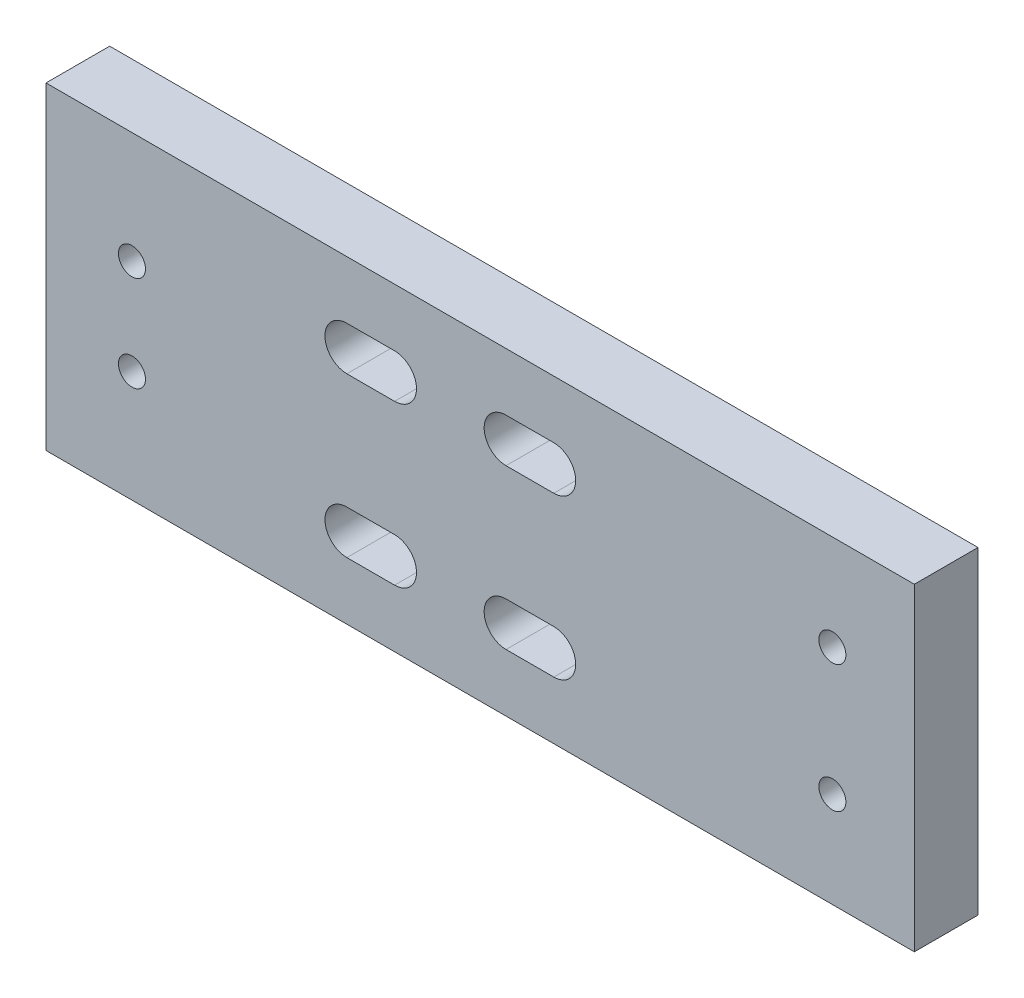
ISO-10303-21;
HEADER;
FILE_DESCRIPTION(('STEP AP214'),'2;1');
FILE_NAME('part.step','',(''),(''),'','','');
FILE_SCHEMA(('AUTOMOTIVE_DESIGN { 1 0 10303 214 1 1 1 1 }'));
ENDSEC;
DATA;
#1=APPLICATION_CONTEXT('core data for automotive mechanical design processes');
#2=APPLICATION_PROTOCOL_DEFINITION('international standard','automotive_design',2000,#1);
#3=PRODUCT_CONTEXT('',#1,'mechanical');
#4=PRODUCT('Part','Part','',(#3));
#5=PRODUCT_RELATED_PRODUCT_CATEGORY('part','',(#4));
#6=PRODUCT_DEFINITION_FORMATION('','',#4);
#7=PRODUCT_DEFINITION_CONTEXT('part definition',#1,'design');
#8=PRODUCT_DEFINITION('design','',#6,#7);
#9=PRODUCT_DEFINITION_SHAPE('','',#8);
#10=(LENGTH_UNIT() NAMED_UNIT(*) SI_UNIT(.MILLI.,.METRE.));
#11=(NAMED_UNIT(*) PLANE_ANGLE_UNIT() SI_UNIT($,.RADIAN.));
#12=(NAMED_UNIT(*) SI_UNIT($,.STERADIAN.) SOLID_ANGLE_UNIT());
#13=UNCERTAINTY_MEASURE_WITH_UNIT(LENGTH_MEASURE(1.E-05),#10,'distance_accuracy_value','');
#14=(GEOMETRIC_REPRESENTATION_CONTEXT(3) GLOBAL_UNCERTAINTY_ASSIGNED_CONTEXT((#13)) GLOBAL_UNIT_ASSIGNED_CONTEXT((#10,
#11,#12)) REPRESENTATION_CONTEXT('',''));
#15=CARTESIAN_POINT('',(0.,0.,0.));
#16=DIRECTION('',(0.,0.,1.));
#17=DIRECTION('',(1.,0.,0.));
#18=AXIS2_PLACEMENT_3D('',#15,#16,#17);
#19=CARTESIAN_POINT('',(0.,0.,246.));
#20=DIRECTION('',(0.,0.,1.));
#21=DIRECTION('',(1.,0.,0.));
#22=AXIS2_PLACEMENT_3D('',#19,#20,#21);
#23=PLANE('',#22);
#24=CARTESIAN_POINT('',(326.,292.,246.));
#25=DIRECTION('',(0.,0.,1.));
#26=DIRECTION('',(1.,0.,0.));
#27=AXIS2_PLACEMENT_3D('',#24,#25,#26);
#28=CIRCLE('',#27,1.69999999999998);
#29=CARTESIAN_POINT('',(327.7,292.,246.));
#30=VERTEX_POINT('',#29);
#31=EDGE_CURVE('E350',#30,#30,#28,.T.);
#32=ORIENTED_EDGE('',*,*,#31,.F.);
#33=EDGE_LOOP('',(#32));
#34=FACE_BOUND('',#33,.T.);
#35=CARTESIAN_POINT('',(238.,294.,246.));
#36=DIRECTION('',(0.,0.,1.));
#37=DIRECTION('',(1.,0.,0.));
#38=AXIS2_PLACEMENT_3D('',#35,#36,#37);
#39=CIRCLE('',#38,1.70000000000001);
#40=CARTESIAN_POINT('',(239.7,294.,246.));
#41=VERTEX_POINT('',#40);
#42=EDGE_CURVE('E207',#41,#41,#39,.T.);
#43=ORIENTED_EDGE('',*,*,#42,.F.);
#44=EDGE_LOOP('',(#43));
#45=FACE_BOUND('',#44,.T.);
#46=DIRECTION('',(0.,-1.,0.));
#47=VECTOR('',#46,1.);
#48=CARTESIAN_POINT('',(227.2,320.,246.));
#49=LINE('',#48,#47);
#50=CARTESIAN_POINT('',(227.2,320.,246.));
#51=VERTEX_POINT('',#50);
#52=CARTESIAN_POINT('',(227.2,280.,246.));
#53=VERTEX_POINT('',#52);
#54=EDGE_CURVE('E310',#51,#53,#49,.T.);
#55=ORIENTED_EDGE('',*,*,#54,.T.);
#56=DIRECTION('',(1.,0.,0.));
#57=VECTOR('',#56,1.);
#58=CARTESIAN_POINT('',(227.2,280.,246.));
#59=LINE('',#58,#57);
#60=CARTESIAN_POINT('',(336.3,280.,246.));
#61=VERTEX_POINT('',#60);
#62=EDGE_CURVE('E313',#53,#61,#59,.T.);
#63=ORIENTED_EDGE('',*,*,#62,.T.);
#64=DIRECTION('',(0.,1.,0.));
#65=VECTOR('',#64,1.);
#66=CARTESIAN_POINT('',(336.3,280.,246.));
#67=LINE('',#66,#65);
#68=CARTESIAN_POINT('',(336.3,320.,246.));
#69=VERTEX_POINT('',#68);
#70=EDGE_CURVE('E316',#61,#69,#67,.T.);
#71=ORIENTED_EDGE('',*,*,#70,.T.);
#72=DIRECTION('',(-1.,0.,0.));
#73=VECTOR('',#72,1.);
#74=CARTESIAN_POINT('',(336.3,320.,246.));
#75=LINE('',#74,#73);
#76=EDGE_CURVE('E318',#69,#51,#75,.T.);
#77=ORIENTED_EDGE('',*,*,#76,.T.);
#78=EDGE_LOOP('',(#55,#63,#71,#77));
#79=FACE_BOUND('',#78,.T.);
#80=DIRECTION('',(1.,0.,0.));
#81=VECTOR('',#80,1.);
#82=CARTESIAN_POINT('',(265.,287.25,246.));
#83=LINE('',#82,#81);
#84=CARTESIAN_POINT('',(265.,287.25,246.));
#85=VERTEX_POINT('',#84);
#86=CARTESIAN_POINT('',(271.,287.25,246.));
#87=VERTEX_POINT('',#86);
#88=EDGE_CURVE('E281',#85,#87,#83,.T.);
#89=ORIENTED_EDGE('',*,*,#88,.F.);
#90=CARTESIAN_POINT('',(265.,290.,246.));
#91=DIRECTION('',(0.,0.,1.));
#92=DIRECTION('',(1.,0.,0.));
#93=AXIS2_PLACEMENT_3D('',#90,#91,#92);
#94=CIRCLE('',#93,2.75);
#95=CARTESIAN_POINT('',(265.,292.75,246.));
#96=VERTEX_POINT('',#95);
#97=EDGE_CURVE('E279',#96,#85,#94,.T.);
#98=ORIENTED_EDGE('',*,*,#97,.F.);
#99=DIRECTION('',(-1.,0.,0.));
#100=VECTOR('',#99,1.);
#101=CARTESIAN_POINT('',(271.,292.75,246.));
#102=LINE('',#101,#100);
#103=CARTESIAN_POINT('',(271.,292.75,246.));
#104=VERTEX_POINT('',#103);
#105=EDGE_CURVE('E287',#104,#96,#102,.T.);
#106=ORIENTED_EDGE('',*,*,#105,.F.);
#107=CARTESIAN_POINT('',(271.,290.,246.));
#108=DIRECTION('',(0.,0.,1.));
#109=DIRECTION('',(1.,0.,0.));
#110=AXIS2_PLACEMENT_3D('',#107,#108,#109);
#111=CIRCLE('',#110,2.75);
#112=EDGE_CURVE('E284',#87,#104,#111,.T.);
#113=ORIENTED_EDGE('',*,*,#112,.F.);
#114=EDGE_LOOP('',(#89,#98,#106,#113));
#115=FACE_BOUND('',#114,.T.);
#116=DIRECTION('',(1.,0.,0.));
#117=VECTOR('',#116,1.);
#118=CARTESIAN_POINT('',(265.,307.25,246.));
#119=LINE('',#118,#117);
#120=CARTESIAN_POINT('',(265.,307.25,246.));
#121=VERTEX_POINT('',#120);
#122=CARTESIAN_POINT('',(271.,307.25,246.));
#123=VERTEX_POINT('',#122);
#124=EDGE_CURVE('E250',#121,#123,#119,.T.);
#125=ORIENTED_EDGE('',*,*,#124,.F.);
#126=CARTESIAN_POINT('',(265.,310.,246.));
#127=DIRECTION('',(0.,0.,1.));
#128=DIRECTION('',(1.,0.,0.));
#129=AXIS2_PLACEMENT_3D('',#126,#127,#128);
#130=CIRCLE('',#129,2.75);
#131=CARTESIAN_POINT('',(265.,312.75,246.));
#132=VERTEX_POINT('',#131);
#133=EDGE_CURVE('E248',#132,#121,#130,.T.);
#134=ORIENTED_EDGE('',*,*,#133,.F.);
#135=DIRECTION('',(-1.,0.,0.));
#136=VECTOR('',#135,1.);
#137=CARTESIAN_POINT('',(271.,312.75,246.));
#138=LINE('',#137,#136);
#139=CARTESIAN_POINT('',(271.,312.75,246.));
#140=VERTEX_POINT('',#139);
#141=EDGE_CURVE('E256',#140,#132,#138,.T.);
#142=ORIENTED_EDGE('',*,*,#141,.F.);
#143=CARTESIAN_POINT('',(271.,310.,246.));
#144=DIRECTION('',(0.,0.,1.));
#145=DIRECTION('',(1.,0.,0.));
#146=AXIS2_PLACEMENT_3D('',#143,#144,#145);
#147=CIRCLE('',#146,2.75);
#148=EDGE_CURVE('E253',#123,#140,#147,.T.);
#149=ORIENTED_EDGE('',*,*,#148,.F.);
#150=EDGE_LOOP('',(#125,#134,#142,#149));
#151=FACE_BOUND('',#150,.T.);
#152=DIRECTION('',(1.,0.,0.));
#153=VECTOR('',#152,1.);
#154=CARTESIAN_POINT('',(285.,287.25,246.));
#155=LINE('',#154,#153);
#156=CARTESIAN_POINT('',(285.,287.25,246.));
#157=VERTEX_POINT('',#156);
#158=CARTESIAN_POINT('',(291.,287.25,246.));
#159=VERTEX_POINT('',#158);
#160=EDGE_CURVE('E219',#157,#159,#155,.T.);
#161=ORIENTED_EDGE('',*,*,#160,.F.);
#162=CARTESIAN_POINT('',(285.,290.,246.));
#163=DIRECTION('',(0.,0.,1.));
#164=DIRECTION('',(1.,0.,0.));
#165=AXIS2_PLACEMENT_3D('',#162,#163,#164);
#166=CIRCLE('',#165,2.75);
#167=CARTESIAN_POINT('',(285.,292.75,246.));
#168=VERTEX_POINT('',#167);
#169=EDGE_CURVE('E217',#168,#157,#166,.T.);
#170=ORIENTED_EDGE('',*,*,#169,.F.);
#171=DIRECTION('',(-1.,0.,0.));
#172=VECTOR('',#171,1.);
#173=CARTESIAN_POINT('',(291.,292.75,246.));
#174=LINE('',#173,#172);
#175=CARTESIAN_POINT('',(291.,292.75,246.));
#176=VERTEX_POINT('',#175);
#177=EDGE_CURVE('E225',#176,#168,#174,.T.);
#178=ORIENTED_EDGE('',*,*,#177,.F.);
#179=CARTESIAN_POINT('',(291.,290.,246.));
#180=DIRECTION('',(0.,0.,1.));
#181=DIRECTION('',(1.,0.,0.));
#182=AXIS2_PLACEMENT_3D('',#179,#180,#181);
#183=CIRCLE('',#182,2.75);
#184=EDGE_CURVE('E222',#159,#176,#183,.T.);
#185=ORIENTED_EDGE('',*,*,#184,.F.);
#186=EDGE_LOOP('',(#161,#170,#178,#185));
#187=FACE_BOUND('',#186,.T.);
#188=DIRECTION('',(1.,0.,0.));
#189=VECTOR('',#188,1.);
#190=CARTESIAN_POINT('',(285.,307.25,246.));
#191=LINE('',#190,#189);
#192=CARTESIAN_POINT('',(285.,307.25,246.));
#193=VERTEX_POINT('',#192);
#194=CARTESIAN_POINT('',(291.,307.25,246.));
#195=VERTEX_POINT('',#194);
#196=EDGE_CURVE('E186',#193,#195,#191,.T.);
#197=ORIENTED_EDGE('',*,*,#196,.F.);
#198=CARTESIAN_POINT('',(285.,310.,246.));
#199=DIRECTION('',(0.,0.,1.));
#200=DIRECTION('',(1.,0.,0.));
#201=AXIS2_PLACEMENT_3D('',#198,#199,#200);
#202=CIRCLE('',#201,2.75);
#203=CARTESIAN_POINT('',(285.,312.75,246.));
#204=VERTEX_POINT('',#203);
#205=EDGE_CURVE('E178',#204,#193,#202,.T.);
#206=ORIENTED_EDGE('',*,*,#205,.F.);
#207=DIRECTION('',(-1.,0.,0.));
#208=VECTOR('',#207,1.);
#209=CARTESIAN_POINT('',(291.,312.75,246.));
#210=LINE('',#209,#208);
#211=CARTESIAN_POINT('',(291.,312.75,246.));
#212=VERTEX_POINT('',#211);
#213=EDGE_CURVE('E201',#212,#204,#210,.T.);
#214=ORIENTED_EDGE('',*,*,#213,.F.);
#215=CARTESIAN_POINT('',(291.,310.,246.));
#216=DIRECTION('',(0.,0.,1.));
#217=DIRECTION('',(1.,0.,0.));
#218=AXIS2_PLACEMENT_3D('',#215,#216,#217);
#219=CIRCLE('',#218,2.75);
#220=EDGE_CURVE('E199',#195,#212,#219,.T.);
#221=ORIENTED_EDGE('',*,*,#220,.F.);
#222=EDGE_LOOP('',(#197,#206,#214,#221));
#223=FACE_BOUND('',#222,.T.);
#224=CARTESIAN_POINT('',(238.,306.,246.));
#225=DIRECTION('',(0.,0.,1.));
#226=DIRECTION('',(1.,0.,0.));
#227=AXIS2_PLACEMENT_3D('',#224,#225,#226);
#228=CIRCLE('',#227,1.70000000000001);
#229=CARTESIAN_POINT('',(239.7,306.,246.));
#230=VERTEX_POINT('',#229);
#231=EDGE_CURVE('E355',#230,#230,#228,.T.);
#232=ORIENTED_EDGE('',*,*,#231,.F.);
#233=EDGE_LOOP('',(#232));
#234=FACE_BOUND('',#233,.T.);
#235=CARTESIAN_POINT('',(326.,308.,246.));
#236=DIRECTION('',(0.,0.,1.));
#237=DIRECTION('',(1.,0.,0.));
#238=AXIS2_PLACEMENT_3D('',#235,#236,#237);
#239=CIRCLE('',#238,1.69999999999998);
#240=CARTESIAN_POINT('',(327.7,308.,246.));
#241=VERTEX_POINT('',#240);
#242=EDGE_CURVE('E346',#241,#241,#239,.T.);
#243=ORIENTED_EDGE('',*,*,#242,.F.);
#244=EDGE_LOOP('',(#243));
#245=FACE_BOUND('',#244,.T.);
#246=ADVANCED_FACE('F39',(#34,#45,#79,#115,#151,#187,#223,#234,#245),#23,.T.);
#247=CARTESIAN_POINT('',(0.,0.,238.));
#248=DIRECTION('',(0.,0.,1.));
#249=DIRECTION('',(1.,0.,0.));
#250=AXIS2_PLACEMENT_3D('',#247,#248,#249);
#251=PLANE('',#250);
#252=CARTESIAN_POINT('',(238.,306.,238.));
#253=DIRECTION('',(0.,0.,1.));
#254=DIRECTION('',(1.,0.,0.));
#255=AXIS2_PLACEMENT_3D('',#252,#253,#254);
#256=CIRCLE('',#255,3.3);
#257=CARTESIAN_POINT('',(241.3,306.,238.));
#258=VERTEX_POINT('',#257);
#259=EDGE_CURVE('E625',#258,#258,#256,.T.);
#260=ORIENTED_EDGE('',*,*,#259,.T.);
#261=EDGE_LOOP('',(#260));
#262=FACE_BOUND('',#261,.T.);
#263=CARTESIAN_POINT('',(326.,292.,238.));
#264=DIRECTION('',(0.,0.,1.));
#265=DIRECTION('',(1.,0.,0.));
#266=AXIS2_PLACEMENT_3D('',#263,#264,#265);
#267=CIRCLE('',#266,3.30000000000003);
#268=CARTESIAN_POINT('',(329.3,292.,238.));
#269=VERTEX_POINT('',#268);
#270=EDGE_CURVE('E630',#269,#269,#267,.T.);
#271=ORIENTED_EDGE('',*,*,#270,.T.);
#272=EDGE_LOOP('',(#271));
#273=FACE_BOUND('',#272,.T.);
#274=CARTESIAN_POINT('',(326.,308.,238.));
#275=DIRECTION('',(0.,0.,1.));
#276=DIRECTION('',(1.,0.,0.));
#277=AXIS2_PLACEMENT_3D('',#274,#275,#276);
#278=CIRCLE('',#277,3.30000000000003);
#279=CARTESIAN_POINT('',(329.3,308.,238.));
#280=VERTEX_POINT('',#279);
#281=EDGE_CURVE('E631',#280,#280,#278,.T.);
#282=ORIENTED_EDGE('',*,*,#281,.T.);
#283=EDGE_LOOP('',(#282));
#284=FACE_BOUND('',#283,.T.);
#285=CARTESIAN_POINT('',(238.,294.,238.));
#286=DIRECTION('',(0.,0.,1.));
#287=DIRECTION('',(1.,0.,0.));
#288=AXIS2_PLACEMENT_3D('',#285,#286,#287);
#289=CIRCLE('',#288,3.3);
#290=CARTESIAN_POINT('',(241.3,294.,238.));
#291=VERTEX_POINT('',#290);
#292=EDGE_CURVE('E358',#291,#291,#289,.T.);
#293=ORIENTED_EDGE('',*,*,#292,.T.);
#294=EDGE_LOOP('',(#293));
#295=FACE_BOUND('',#294,.T.);
#296=CARTESIAN_POINT('',(285.,290.,238.));
#297=DIRECTION('',(0.,0.,1.));
#298=DIRECTION('',(1.,0.,0.));
#299=AXIS2_PLACEMENT_3D('',#296,#297,#298);
#300=CIRCLE('',#299,2.75);
#301=CARTESIAN_POINT('',(285.,292.75,238.));
#302=VERTEX_POINT('',#301);
#303=CARTESIAN_POINT('',(285.,287.25,238.));
#304=VERTEX_POINT('',#303);
#305=EDGE_CURVE('E194',#302,#304,#300,.T.);
#306=ORIENTED_EDGE('',*,*,#305,.T.);
#307=DIRECTION('',(1.,0.,0.));
#308=VECTOR('',#307,1.);
#309=CARTESIAN_POINT('',(285.,287.25,238.));
#310=LINE('',#309,#308);
#311=CARTESIAN_POINT('',(291.,287.25,238.));
#312=VERTEX_POINT('',#311);
#313=EDGE_CURVE('E230',#304,#312,#310,.T.);
#314=ORIENTED_EDGE('',*,*,#313,.T.);
#315=CARTESIAN_POINT('',(291.,290.,238.));
#316=DIRECTION('',(0.,0.,1.));
#317=DIRECTION('',(1.,0.,0.));
#318=AXIS2_PLACEMENT_3D('',#315,#316,#317);
#319=CIRCLE('',#318,2.75);
#320=CARTESIAN_POINT('',(291.,292.75,238.));
#321=VERTEX_POINT('',#320);
#322=EDGE_CURVE('E233',#312,#321,#319,.T.);
#323=ORIENTED_EDGE('',*,*,#322,.T.);
#324=DIRECTION('',(-1.,0.,0.));
#325=VECTOR('',#324,1.);
#326=CARTESIAN_POINT('',(291.,292.75,238.));
#327=LINE('',#326,#325);
#328=EDGE_CURVE('E220',#321,#302,#327,.T.);
#329=ORIENTED_EDGE('',*,*,#328,.T.);
#330=EDGE_LOOP('',(#306,#314,#323,#329));
#331=FACE_BOUND('',#330,.T.);
#332=CARTESIAN_POINT('',(265.,290.,238.));
#333=DIRECTION('',(0.,0.,1.));
#334=DIRECTION('',(1.,0.,0.));
#335=AXIS2_PLACEMENT_3D('',#332,#333,#334);
#336=CIRCLE('',#335,2.75);
#337=CARTESIAN_POINT('',(265.,292.75,238.));
#338=VERTEX_POINT('',#337);
#339=CARTESIAN_POINT('',(265.,287.25,238.));
#340=VERTEX_POINT('',#339);
#341=EDGE_CURVE('E278',#338,#340,#336,.T.);
#342=ORIENTED_EDGE('',*,*,#341,.T.);
#343=DIRECTION('',(1.,0.,0.));
#344=VECTOR('',#343,1.);
#345=CARTESIAN_POINT('',(265.,287.25,238.));
#346=LINE('',#345,#344);
#347=CARTESIAN_POINT('',(271.,287.25,238.));
#348=VERTEX_POINT('',#347);
#349=EDGE_CURVE('E292',#340,#348,#346,.T.);
#350=ORIENTED_EDGE('',*,*,#349,.T.);
#351=CARTESIAN_POINT('',(271.,290.,238.));
#352=DIRECTION('',(0.,0.,1.));
#353=DIRECTION('',(1.,0.,0.));
#354=AXIS2_PLACEMENT_3D('',#351,#352,#353);
#355=CIRCLE('',#354,2.75);
#356=CARTESIAN_POINT('',(271.,292.75,238.));
#357=VERTEX_POINT('',#356);
#358=EDGE_CURVE('E295',#348,#357,#355,.T.);
#359=ORIENTED_EDGE('',*,*,#358,.T.);
#360=DIRECTION('',(-1.,0.,0.));
#361=VECTOR('',#360,1.);
#362=CARTESIAN_POINT('',(271.,292.75,238.));
#363=LINE('',#362,#361);
#364=EDGE_CURVE('E282',#357,#338,#363,.T.);
#365=ORIENTED_EDGE('',*,*,#364,.T.);
#366=EDGE_LOOP('',(#342,#350,#359,#365));
#367=FACE_BOUND('',#366,.T.);
#368=DIRECTION('',(0.,-1.,0.));
#369=VECTOR('',#368,1.);
#370=CARTESIAN_POINT('',(227.2,320.,238.));
#371=LINE('',#370,#369);
#372=CARTESIAN_POINT('',(227.2,320.,238.));
#373=VERTEX_POINT('',#372);
#374=CARTESIAN_POINT('',(227.2,280.,238.));
#375=VERTEX_POINT('',#374);
#376=EDGE_CURVE('E309',#373,#375,#371,.T.);
#377=ORIENTED_EDGE('',*,*,#376,.F.);
#378=DIRECTION('',(-1.,0.,0.));
#379=VECTOR('',#378,1.);
#380=CARTESIAN_POINT('',(336.3,320.,238.));
#381=LINE('',#380,#379);
#382=CARTESIAN_POINT('',(336.3,320.,238.));
#383=VERTEX_POINT('',#382);
#384=EDGE_CURVE('E314',#383,#373,#381,.T.);
#385=ORIENTED_EDGE('',*,*,#384,.F.);
#386=DIRECTION('',(0.,1.,0.));
#387=VECTOR('',#386,1.);
#388=CARTESIAN_POINT('',(336.3,280.,238.));
#389=LINE('',#388,#387);
#390=CARTESIAN_POINT('',(336.3,280.,238.));
#391=VERTEX_POINT('',#390);
#392=EDGE_CURVE('E325',#391,#383,#389,.T.);
#393=ORIENTED_EDGE('',*,*,#392,.F.);
#394=DIRECTION('',(1.,0.,0.));
#395=VECTOR('',#394,1.);
#396=CARTESIAN_POINT('',(227.2,280.,238.));
#397=LINE('',#396,#395);
#398=EDGE_CURVE('E323',#375,#391,#397,.T.);
#399=ORIENTED_EDGE('',*,*,#398,.F.);
#400=EDGE_LOOP('',(#377,#385,#393,#399));
#401=FACE_BOUND('',#400,.T.);
#402=CARTESIAN_POINT('',(265.,310.,238.));
#403=DIRECTION('',(0.,0.,1.));
#404=DIRECTION('',(1.,0.,0.));
#405=AXIS2_PLACEMENT_3D('',#402,#403,#404);
#406=CIRCLE('',#405,2.75);
#407=CARTESIAN_POINT('',(265.,312.75,238.));
#408=VERTEX_POINT('',#407);
#409=CARTESIAN_POINT('',(265.,307.25,238.));
#410=VERTEX_POINT('',#409);
#411=EDGE_CURVE('E247',#408,#410,#406,.T.);
#412=ORIENTED_EDGE('',*,*,#411,.T.);
#413=DIRECTION('',(1.,0.,0.));
#414=VECTOR('',#413,1.);
#415=CARTESIAN_POINT('',(265.,307.25,238.));
#416=LINE('',#415,#414);
#417=CARTESIAN_POINT('',(271.,307.25,238.));
#418=VERTEX_POINT('',#417);
#419=EDGE_CURVE('E261',#410,#418,#416,.T.);
#420=ORIENTED_EDGE('',*,*,#419,.T.);
#421=CARTESIAN_POINT('',(271.,310.,238.));
#422=DIRECTION('',(0.,0.,1.));
#423=DIRECTION('',(1.,0.,0.));
#424=AXIS2_PLACEMENT_3D('',#421,#422,#423);
#425=CIRCLE('',#424,2.75);
#426=CARTESIAN_POINT('',(271.,312.75,238.));
#427=VERTEX_POINT('',#426);
#428=EDGE_CURVE('E264',#418,#427,#425,.T.);
#429=ORIENTED_EDGE('',*,*,#428,.T.);
#430=DIRECTION('',(-1.,0.,0.));
#431=VECTOR('',#430,1.);
#432=CARTESIAN_POINT('',(271.,312.75,238.));
#433=LINE('',#432,#431);
#434=EDGE_CURVE('E251',#427,#408,#433,.T.);
#435=ORIENTED_EDGE('',*,*,#434,.T.);
#436=EDGE_LOOP('',(#412,#420,#429,#435));
#437=FACE_BOUND('',#436,.T.);
#438=CARTESIAN_POINT('',(285.,310.,238.));
#439=DIRECTION('',(0.,0.,1.));
#440=DIRECTION('',(1.,0.,0.));
#441=AXIS2_PLACEMENT_3D('',#438,#439,#440);
#442=CIRCLE('',#441,2.75);
#443=CARTESIAN_POINT('',(285.,312.75,238.));
#444=VERTEX_POINT('',#443);
#445=CARTESIAN_POINT('',(285.,307.25,238.));
#446=VERTEX_POINT('',#445);
#447=EDGE_CURVE('E64',#444,#446,#442,.T.);
#448=ORIENTED_EDGE('',*,*,#447,.T.);
#449=DIRECTION('',(1.,0.,0.));
#450=VECTOR('',#449,1.);
#451=CARTESIAN_POINT('',(285.,307.25,238.));
#452=LINE('',#451,#450);
#453=CARTESIAN_POINT('',(291.,307.25,238.));
#454=VERTEX_POINT('',#453);
#455=EDGE_CURVE('E193',#446,#454,#452,.T.);
#456=ORIENTED_EDGE('',*,*,#455,.T.);
#457=CARTESIAN_POINT('',(291.,310.,238.));
#458=DIRECTION('',(0.,0.,1.));
#459=DIRECTION('',(1.,0.,0.));
#460=AXIS2_PLACEMENT_3D('',#457,#458,#459);
#461=CIRCLE('',#460,2.75);
#462=CARTESIAN_POINT('',(291.,312.75,238.));
#463=VERTEX_POINT('',#462);
#464=EDGE_CURVE('E209',#454,#463,#461,.T.);
#465=ORIENTED_EDGE('',*,*,#464,.T.);
#466=DIRECTION('',(-1.,0.,0.));
#467=VECTOR('',#466,1.);
#468=CARTESIAN_POINT('',(291.,312.75,238.));
#469=LINE('',#468,#467);
#470=EDGE_CURVE('E187',#463,#444,#469,.T.);
#471=ORIENTED_EDGE('',*,*,#470,.T.);
#472=EDGE_LOOP('',(#448,#456,#465,#471));
#473=FACE_BOUND('',#472,.T.);
#474=ADVANCED_FACE('F369',(#262,#273,#284,#295,#331,#367,#401,#437,#473),#251,.F.);
#475=CARTESIAN_POINT('',(227.2,320.,246.));
#476=DIRECTION('',(1.,0.,0.));
#477=DIRECTION('',(0.,0.,-1.));
#478=AXIS2_PLACEMENT_3D('',#475,#476,#477);
#479=PLANE('',#478);
#480=ORIENTED_EDGE('',*,*,#376,.T.);
#481=DIRECTION('',(0.,0.,-1.));
#482=VECTOR('',#481,1.);
#483=CARTESIAN_POINT('',(227.2,280.,246.));
#484=LINE('',#483,#482);
#485=EDGE_CURVE('E11',#53,#375,#484,.T.);
#486=ORIENTED_EDGE('',*,*,#485,.F.);
#487=ORIENTED_EDGE('',*,*,#54,.F.);
#488=DIRECTION('',(0.,0.,-1.));
#489=VECTOR('',#488,1.);
#490=CARTESIAN_POINT('',(227.2,320.,246.));
#491=LINE('',#490,#489);
#492=EDGE_CURVE('E320',#51,#373,#491,.T.);
#493=ORIENTED_EDGE('',*,*,#492,.T.);
#494=EDGE_LOOP('',(#480,#486,#487,#493));
#495=FACE_BOUND('',#494,.T.);
#496=ADVANCED_FACE('F41',(#495),#479,.F.);
#497=CARTESIAN_POINT('',(227.2,280.,246.));
#498=DIRECTION('',(0.,1.,0.));
#499=DIRECTION('',(0.,0.,1.));
#500=AXIS2_PLACEMENT_3D('',#497,#498,#499);
#501=PLANE('',#500);
#502=ORIENTED_EDGE('',*,*,#398,.T.);
#503=DIRECTION('',(0.,0.,-1.));
#504=VECTOR('',#503,1.);
#505=CARTESIAN_POINT('',(336.3,280.,246.));
#506=LINE('',#505,#504);
#507=EDGE_CURVE('E48',#61,#391,#506,.T.);
#508=ORIENTED_EDGE('',*,*,#507,.F.);
#509=ORIENTED_EDGE('',*,*,#62,.F.);
#510=ORIENTED_EDGE('',*,*,#485,.T.);
#511=EDGE_LOOP('',(#502,#508,#509,#510));
#512=FACE_BOUND('',#511,.T.);
#513=ADVANCED_FACE('F457',(#512),#501,.F.);
#514=CARTESIAN_POINT('',(336.3,280.,246.));
#515=DIRECTION('',(-1.,0.,0.));
#516=DIRECTION('',(0.,0.,1.));
#517=AXIS2_PLACEMENT_3D('',#514,#515,#516);
#518=PLANE('',#517);
#519=ORIENTED_EDGE('',*,*,#392,.T.);
#520=DIRECTION('',(0.,0.,-1.));
#521=VECTOR('',#520,1.);
#522=CARTESIAN_POINT('',(336.3,320.,246.));
#523=LINE('',#522,#521);
#524=EDGE_CURVE('E330',#69,#383,#523,.T.);
#525=ORIENTED_EDGE('',*,*,#524,.F.);
#526=ORIENTED_EDGE('',*,*,#70,.F.);
#527=ORIENTED_EDGE('',*,*,#507,.T.);
#528=EDGE_LOOP('',(#519,#525,#526,#527));
#529=FACE_BOUND('',#528,.T.);
#530=ADVANCED_FACE('F454',(#529),#518,.F.);
#531=CARTESIAN_POINT('',(336.3,320.,246.));
#532=DIRECTION('',(0.,-1.,0.));
#533=DIRECTION('',(0.,0.,-1.));
#534=AXIS2_PLACEMENT_3D('',#531,#532,#533);
#535=PLANE('',#534);
#536=ORIENTED_EDGE('',*,*,#384,.T.);
#537=ORIENTED_EDGE('',*,*,#492,.F.);
#538=ORIENTED_EDGE('',*,*,#76,.F.);
#539=ORIENTED_EDGE('',*,*,#524,.T.);
#540=EDGE_LOOP('',(#536,#537,#538,#539));
#541=FACE_BOUND('',#540,.T.);
#542=ADVANCED_FACE('F446',(#541),#535,.F.);
#543=CARTESIAN_POINT('',(265.,290.,246.));
#544=DIRECTION('',(0.,0.,-1.));
#545=DIRECTION('',(-1.,0.,0.));
#546=AXIS2_PLACEMENT_3D('',#543,#544,#545);
#547=CYLINDRICAL_SURFACE('',#546,2.75);
#548=ORIENTED_EDGE('',*,*,#341,.F.);
#549=DIRECTION('',(0.,0.,-1.));
#550=VECTOR('',#549,1.);
#551=CARTESIAN_POINT('',(265.,292.75,246.));
#552=LINE('',#551,#550);
#553=EDGE_CURVE('E289',#96,#338,#552,.T.);
#554=ORIENTED_EDGE('',*,*,#553,.F.);
#555=ORIENTED_EDGE('',*,*,#97,.T.);
#556=DIRECTION('',(0.,0.,-1.));
#557=VECTOR('',#556,1.);
#558=CARTESIAN_POINT('',(265.,287.25,246.));
#559=LINE('',#558,#557);
#560=EDGE_CURVE('E306',#85,#340,#559,.T.);
#561=ORIENTED_EDGE('',*,*,#560,.T.);
#562=EDGE_LOOP('',(#548,#554,#555,#561));
#563=FACE_BOUND('',#562,.T.);
#564=ADVANCED_FACE('F443',(#563),#547,.F.);
#565=CARTESIAN_POINT('',(265.,287.25,246.));
#566=DIRECTION('',(0.,1.,0.));
#567=DIRECTION('',(0.,0.,1.));
#568=AXIS2_PLACEMENT_3D('',#565,#566,#567);
#569=PLANE('',#568);
#570=ORIENTED_EDGE('',*,*,#349,.F.);
#571=ORIENTED_EDGE('',*,*,#560,.F.);
#572=ORIENTED_EDGE('',*,*,#88,.T.);
#573=DIRECTION('',(0.,0.,-1.));
#574=VECTOR('',#573,1.);
#575=CARTESIAN_POINT('',(271.,287.25,246.));
#576=LINE('',#575,#574);
#577=EDGE_CURVE('E304',#87,#348,#576,.T.);
#578=ORIENTED_EDGE('',*,*,#577,.T.);
#579=EDGE_LOOP('',(#570,#571,#572,#578));
#580=FACE_BOUND('',#579,.T.);
#581=ADVANCED_FACE('F439',(#580),#569,.T.);
#582=CARTESIAN_POINT('',(271.,290.,246.));
#583=DIRECTION('',(0.,0.,-1.));
#584=DIRECTION('',(-1.,0.,0.));
#585=AXIS2_PLACEMENT_3D('',#582,#583,#584);
#586=CYLINDRICAL_SURFACE('',#585,2.75);
#587=ORIENTED_EDGE('',*,*,#358,.F.);
#588=ORIENTED_EDGE('',*,*,#577,.F.);
#589=ORIENTED_EDGE('',*,*,#112,.T.);
#590=DIRECTION('',(0.,0.,-1.));
#591=VECTOR('',#590,1.);
#592=CARTESIAN_POINT('',(271.,292.75,246.));
#593=LINE('',#592,#591);
#594=EDGE_CURVE('E302',#104,#357,#593,.T.);
#595=ORIENTED_EDGE('',*,*,#594,.T.);
#596=EDGE_LOOP('',(#587,#588,#589,#595));
#597=FACE_BOUND('',#596,.T.);
#598=ADVANCED_FACE('F435',(#597),#586,.F.);
#599=CARTESIAN_POINT('',(271.,292.75,246.));
#600=DIRECTION('',(0.,-1.,0.));
#601=DIRECTION('',(0.,0.,-1.));
#602=AXIS2_PLACEMENT_3D('',#599,#600,#601);
#603=PLANE('',#602);
#604=ORIENTED_EDGE('',*,*,#364,.F.);
#605=ORIENTED_EDGE('',*,*,#594,.F.);
#606=ORIENTED_EDGE('',*,*,#105,.T.);
#607=ORIENTED_EDGE('',*,*,#553,.T.);
#608=EDGE_LOOP('',(#604,#605,#606,#607));
#609=FACE_BOUND('',#608,.T.);
#610=ADVANCED_FACE('F431',(#609),#603,.T.);
#611=CARTESIAN_POINT('',(265.,310.,246.));
#612=DIRECTION('',(0.,0.,-1.));
#613=DIRECTION('',(-1.,0.,0.));
#614=AXIS2_PLACEMENT_3D('',#611,#612,#613);
#615=CYLINDRICAL_SURFACE('',#614,2.75);
#616=ORIENTED_EDGE('',*,*,#411,.F.);
#617=DIRECTION('',(0.,0.,-1.));
#618=VECTOR('',#617,1.);
#619=CARTESIAN_POINT('',(265.,312.75,246.));
#620=LINE('',#619,#618);
#621=EDGE_CURVE('E258',#132,#408,#620,.T.);
#622=ORIENTED_EDGE('',*,*,#621,.F.);
#623=ORIENTED_EDGE('',*,*,#133,.T.);
#624=DIRECTION('',(0.,0.,-1.));
#625=VECTOR('',#624,1.);
#626=CARTESIAN_POINT('',(265.,307.25,246.));
#627=LINE('',#626,#625);
#628=EDGE_CURVE('E275',#121,#410,#627,.T.);
#629=ORIENTED_EDGE('',*,*,#628,.T.);
#630=EDGE_LOOP('',(#616,#622,#623,#629));
#631=FACE_BOUND('',#630,.T.);
#632=ADVANCED_FACE('F427',(#631),#615,.F.);
#633=CARTESIAN_POINT('',(265.,307.25,246.));
#634=DIRECTION('',(0.,1.,0.));
#635=DIRECTION('',(0.,0.,1.));
#636=AXIS2_PLACEMENT_3D('',#633,#634,#635);
#637=PLANE('',#636);
#638=ORIENTED_EDGE('',*,*,#419,.F.);
#639=ORIENTED_EDGE('',*,*,#628,.F.);
#640=ORIENTED_EDGE('',*,*,#124,.T.);
#641=DIRECTION('',(0.,0.,-1.));
#642=VECTOR('',#641,1.);
#643=CARTESIAN_POINT('',(271.,307.25,246.));
#644=LINE('',#643,#642);
#645=EDGE_CURVE('E273',#123,#418,#644,.T.);
#646=ORIENTED_EDGE('',*,*,#645,.T.);
#647=EDGE_LOOP('',(#638,#639,#640,#646));
#648=FACE_BOUND('',#647,.T.);
#649=ADVANCED_FACE('F423',(#648),#637,.T.);
#650=CARTESIAN_POINT('',(271.,310.,246.));
#651=DIRECTION('',(0.,0.,-1.));
#652=DIRECTION('',(-1.,0.,0.));
#653=AXIS2_PLACEMENT_3D('',#650,#651,#652);
#654=CYLINDRICAL_SURFACE('',#653,2.75);
#655=ORIENTED_EDGE('',*,*,#428,.F.);
#656=ORIENTED_EDGE('',*,*,#645,.F.);
#657=ORIENTED_EDGE('',*,*,#148,.T.);
#658=DIRECTION('',(0.,0.,-1.));
#659=VECTOR('',#658,1.);
#660=CARTESIAN_POINT('',(271.,312.75,246.));
#661=LINE('',#660,#659);
#662=EDGE_CURVE('E271',#140,#427,#661,.T.);
#663=ORIENTED_EDGE('',*,*,#662,.T.);
#664=EDGE_LOOP('',(#655,#656,#657,#663));
#665=FACE_BOUND('',#664,.T.);
#666=ADVANCED_FACE('F419',(#665),#654,.F.);
#667=CARTESIAN_POINT('',(271.,312.75,246.));
#668=DIRECTION('',(0.,-1.,0.));
#669=DIRECTION('',(0.,0.,-1.));
#670=AXIS2_PLACEMENT_3D('',#667,#668,#669);
#671=PLANE('',#670);
#672=ORIENTED_EDGE('',*,*,#434,.F.);
#673=ORIENTED_EDGE('',*,*,#662,.F.);
#674=ORIENTED_EDGE('',*,*,#141,.T.);
#675=ORIENTED_EDGE('',*,*,#621,.T.);
#676=EDGE_LOOP('',(#672,#673,#674,#675));
#677=FACE_BOUND('',#676,.T.);
#678=ADVANCED_FACE('F416',(#677),#671,.T.);
#679=CARTESIAN_POINT('',(285.,290.,246.));
#680=DIRECTION('',(0.,0.,-1.));
#681=DIRECTION('',(-1.,0.,0.));
#682=AXIS2_PLACEMENT_3D('',#679,#680,#681);
#683=CYLINDRICAL_SURFACE('',#682,2.75);
#684=ORIENTED_EDGE('',*,*,#305,.F.);
#685=DIRECTION('',(0.,0.,-1.));
#686=VECTOR('',#685,1.);
#687=CARTESIAN_POINT('',(285.,292.75,246.));
#688=LINE('',#687,#686);
#689=EDGE_CURVE('E227',#168,#302,#688,.T.);
#690=ORIENTED_EDGE('',*,*,#689,.F.);
#691=ORIENTED_EDGE('',*,*,#169,.T.);
#692=DIRECTION('',(0.,0.,-1.));
#693=VECTOR('',#692,1.);
#694=CARTESIAN_POINT('',(285.,287.25,246.));
#695=LINE('',#694,#693);
#696=EDGE_CURVE('E244',#157,#304,#695,.T.);
#697=ORIENTED_EDGE('',*,*,#696,.T.);
#698=EDGE_LOOP('',(#684,#690,#691,#697));
#699=FACE_BOUND('',#698,.T.);
#700=ADVANCED_FACE('F398',(#699),#683,.F.);
#701=CARTESIAN_POINT('',(285.,287.25,246.));
#702=DIRECTION('',(0.,1.,0.));
#703=DIRECTION('',(0.,0.,1.));
#704=AXIS2_PLACEMENT_3D('',#701,#702,#703);
#705=PLANE('',#704);
#706=ORIENTED_EDGE('',*,*,#313,.F.);
#707=ORIENTED_EDGE('',*,*,#696,.F.);
#708=ORIENTED_EDGE('',*,*,#160,.T.);
#709=DIRECTION('',(0.,0.,-1.));
#710=VECTOR('',#709,1.);
#711=CARTESIAN_POINT('',(291.,287.25,246.));
#712=LINE('',#711,#710);
#713=EDGE_CURVE('E242',#159,#312,#712,.T.);
#714=ORIENTED_EDGE('',*,*,#713,.T.);
#715=EDGE_LOOP('',(#706,#707,#708,#714));
#716=FACE_BOUND('',#715,.T.);
#717=ADVANCED_FACE('F390',(#716),#705,.T.);
#718=CARTESIAN_POINT('',(291.,290.,246.));
#719=DIRECTION('',(0.,0.,-1.));
#720=DIRECTION('',(-1.,0.,0.));
#721=AXIS2_PLACEMENT_3D('',#718,#719,#720);
#722=CYLINDRICAL_SURFACE('',#721,2.75);
#723=ORIENTED_EDGE('',*,*,#322,.F.);
#724=ORIENTED_EDGE('',*,*,#713,.F.);
#725=ORIENTED_EDGE('',*,*,#184,.T.);
#726=DIRECTION('',(0.,0.,-1.));
#727=VECTOR('',#726,1.);
#728=CARTESIAN_POINT('',(291.,292.75,246.));
#729=LINE('',#728,#727);
#730=EDGE_CURVE('E240',#176,#321,#729,.T.);
#731=ORIENTED_EDGE('',*,*,#730,.T.);
#732=EDGE_LOOP('',(#723,#724,#725,#731));
#733=FACE_BOUND('',#732,.T.);
#734=ADVANCED_FACE('F393',(#733),#722,.F.);
#735=CARTESIAN_POINT('',(291.,292.75,246.));
#736=DIRECTION('',(0.,-1.,0.));
#737=DIRECTION('',(0.,0.,-1.));
#738=AXIS2_PLACEMENT_3D('',#735,#736,#737);
#739=PLANE('',#738);
#740=ORIENTED_EDGE('',*,*,#328,.F.);
#741=ORIENTED_EDGE('',*,*,#730,.F.);
#742=ORIENTED_EDGE('',*,*,#177,.T.);
#743=ORIENTED_EDGE('',*,*,#689,.T.);
#744=EDGE_LOOP('',(#740,#741,#742,#743));
#745=FACE_BOUND('',#744,.T.);
#746=ADVANCED_FACE('F401',(#745),#739,.T.);
#747=CARTESIAN_POINT('',(285.,310.,246.));
#748=DIRECTION('',(0.,0.,-1.));
#749=DIRECTION('',(-1.,0.,0.));
#750=AXIS2_PLACEMENT_3D('',#747,#748,#749);
#751=CYLINDRICAL_SURFACE('',#750,2.75);
#752=ORIENTED_EDGE('',*,*,#447,.F.);
#753=DIRECTION('',(0.,0.,-1.));
#754=VECTOR('',#753,1.);
#755=CARTESIAN_POINT('',(285.,312.75,246.));
#756=LINE('',#755,#754);
#757=EDGE_CURVE('E182',#204,#444,#756,.T.);
#758=ORIENTED_EDGE('',*,*,#757,.F.);
#759=ORIENTED_EDGE('',*,*,#205,.T.);
#760=DIRECTION('',(0.,0.,-1.));
#761=VECTOR('',#760,1.);
#762=CARTESIAN_POINT('',(285.,307.25,246.));
#763=LINE('',#762,#761);
#764=EDGE_CURVE('E181',#193,#446,#763,.T.);
#765=ORIENTED_EDGE('',*,*,#764,.T.);
#766=EDGE_LOOP('',(#752,#758,#759,#765));
#767=FACE_BOUND('',#766,.T.);
#768=ADVANCED_FACE('F180',(#767),#751,.F.);
#769=CARTESIAN_POINT('',(285.,307.25,246.));
#770=DIRECTION('',(0.,1.,0.));
#771=DIRECTION('',(0.,0.,1.));
#772=AXIS2_PLACEMENT_3D('',#769,#770,#771);
#773=PLANE('',#772);
#774=ORIENTED_EDGE('',*,*,#455,.F.);
#775=ORIENTED_EDGE('',*,*,#764,.F.);
#776=ORIENTED_EDGE('',*,*,#196,.T.);
#777=DIRECTION('',(0.,0.,-1.));
#778=VECTOR('',#777,1.);
#779=CARTESIAN_POINT('',(291.,307.25,246.));
#780=LINE('',#779,#778);
#781=EDGE_CURVE('E195',#195,#454,#780,.T.);
#782=ORIENTED_EDGE('',*,*,#781,.T.);
#783=EDGE_LOOP('',(#774,#775,#776,#782));
#784=FACE_BOUND('',#783,.T.);
#785=ADVANCED_FACE('F190',(#784),#773,.T.);
#786=CARTESIAN_POINT('',(291.,310.,246.));
#787=DIRECTION('',(0.,0.,-1.));
#788=DIRECTION('',(-1.,0.,0.));
#789=AXIS2_PLACEMENT_3D('',#786,#787,#788);
#790=CYLINDRICAL_SURFACE('',#789,2.75);
#791=ORIENTED_EDGE('',*,*,#464,.F.);
#792=ORIENTED_EDGE('',*,*,#781,.F.);
#793=ORIENTED_EDGE('',*,*,#220,.T.);
#794=DIRECTION('',(0.,0.,-1.));
#795=VECTOR('',#794,1.);
#796=CARTESIAN_POINT('',(291.,312.75,246.));
#797=LINE('',#796,#795);
#798=EDGE_CURVE('E56',#212,#463,#797,.T.);
#799=ORIENTED_EDGE('',*,*,#798,.T.);
#800=EDGE_LOOP('',(#791,#792,#793,#799));
#801=FACE_BOUND('',#800,.T.);
#802=ADVANCED_FACE('F479',(#801),#790,.F.);
#803=CARTESIAN_POINT('',(291.,312.75,246.));
#804=DIRECTION('',(0.,-1.,0.));
#805=DIRECTION('',(0.,0.,-1.));
#806=AXIS2_PLACEMENT_3D('',#803,#804,#805);
#807=PLANE('',#806);
#808=ORIENTED_EDGE('',*,*,#470,.F.);
#809=ORIENTED_EDGE('',*,*,#798,.F.);
#810=ORIENTED_EDGE('',*,*,#213,.T.);
#811=ORIENTED_EDGE('',*,*,#757,.T.);
#812=EDGE_LOOP('',(#808,#809,#810,#811));
#813=FACE_BOUND('',#812,.T.);
#814=ADVANCED_FACE('F477',(#813),#807,.T.);
#815=CARTESIAN_POINT('',(238.,294.,246.));
#816=DIRECTION('',(0.,0.,-1.));
#817=DIRECTION('',(-1.,0.,0.));
#818=AXIS2_PLACEMENT_3D('',#815,#816,#817);
#819=CYLINDRICAL_SURFACE('',#818,1.70000000000001);
#820=CARTESIAN_POINT('',(238.,294.,241.5));
#821=DIRECTION('',(0.,0.,1.));
#822=DIRECTION('',(1.,0.,0.));
#823=AXIS2_PLACEMENT_3D('',#820,#821,#822);
#824=CIRCLE('',#823,1.70000000000001);
#825=CARTESIAN_POINT('',(239.7,294.,241.5));
#826=VERTEX_POINT('',#825);
#827=EDGE_CURVE('E43',#826,#826,#824,.T.);
#828=ORIENTED_EDGE('',*,*,#827,.F.);
#829=EDGE_LOOP('',(#828));
#830=FACE_BOUND('',#829,.T.);
#831=ORIENTED_EDGE('',*,*,#42,.T.);
#832=EDGE_LOOP('',(#831));
#833=FACE_BOUND('',#832,.T.);
#834=ADVANCED_FACE('F365',(#830,#833),#819,.F.);
#835=CARTESIAN_POINT('',(238.,306.,246.));
#836=DIRECTION('',(0.,0.,-1.));
#837=DIRECTION('',(-1.,0.,0.));
#838=AXIS2_PLACEMENT_3D('',#835,#836,#837);
#839=CYLINDRICAL_SURFACE('',#838,1.70000000000001);
#840=CARTESIAN_POINT('',(238.,306.,241.5));
#841=DIRECTION('',(0.,0.,1.));
#842=DIRECTION('',(1.,0.,0.));
#843=AXIS2_PLACEMENT_3D('',#840,#841,#842);
#844=CIRCLE('',#843,1.70000000000001);
#845=CARTESIAN_POINT('',(239.7,306.,241.5));
#846=VERTEX_POINT('',#845);
#847=EDGE_CURVE('E341',#846,#846,#844,.T.);
#848=ORIENTED_EDGE('',*,*,#847,.F.);
#849=EDGE_LOOP('',(#848));
#850=FACE_BOUND('',#849,.T.);
#851=ORIENTED_EDGE('',*,*,#231,.T.);
#852=EDGE_LOOP('',(#851));
#853=FACE_BOUND('',#852,.T.);
#854=ADVANCED_FACE('F485',(#850,#853),#839,.F.);
#855=CARTESIAN_POINT('',(326.,292.,246.));
#856=DIRECTION('',(0.,0.,-1.));
#857=DIRECTION('',(-1.,0.,0.));
#858=AXIS2_PLACEMENT_3D('',#855,#856,#857);
#859=CYLINDRICAL_SURFACE('',#858,1.69999999999998);
#860=CARTESIAN_POINT('',(326.,292.,241.5));
#861=DIRECTION('',(0.,0.,1.));
#862=DIRECTION('',(1.,0.,0.));
#863=AXIS2_PLACEMENT_3D('',#860,#861,#862);
#864=CIRCLE('',#863,1.69999999999998);
#865=CARTESIAN_POINT('',(327.7,292.,241.5));
#866=VERTEX_POINT('',#865);
#867=EDGE_CURVE('E338',#866,#866,#864,.T.);
#868=ORIENTED_EDGE('',*,*,#867,.F.);
#869=EDGE_LOOP('',(#868));
#870=FACE_BOUND('',#869,.T.);
#871=ORIENTED_EDGE('',*,*,#31,.T.);
#872=EDGE_LOOP('',(#871));
#873=FACE_BOUND('',#872,.T.);
#874=ADVANCED_FACE('F521',(#870,#873),#859,.F.);
#875=CARTESIAN_POINT('',(326.,308.,246.));
#876=DIRECTION('',(0.,0.,-1.));
#877=DIRECTION('',(-1.,0.,0.));
#878=AXIS2_PLACEMENT_3D('',#875,#876,#877);
#879=CYLINDRICAL_SURFACE('',#878,1.69999999999998);
#880=CARTESIAN_POINT('',(326.,308.,241.5));
#881=DIRECTION('',(0.,0.,1.));
#882=DIRECTION('',(1.,0.,0.));
#883=AXIS2_PLACEMENT_3D('',#880,#881,#882);
#884=CIRCLE('',#883,1.69999999999998);
#885=CARTESIAN_POINT('',(327.7,308.,241.5));
#886=VERTEX_POINT('',#885);
#887=EDGE_CURVE('E335',#886,#886,#884,.T.);
#888=ORIENTED_EDGE('',*,*,#887,.F.);
#889=EDGE_LOOP('',(#888));
#890=FACE_BOUND('',#889,.T.);
#891=ORIENTED_EDGE('',*,*,#242,.T.);
#892=EDGE_LOOP('',(#891));
#893=FACE_BOUND('',#892,.T.);
#894=ADVANCED_FACE('F530',(#890,#893),#879,.F.);
#895=CARTESIAN_POINT('',(326.,308.,241.5));
#896=DIRECTION('',(0.,0.,-1.));
#897=DIRECTION('',(-1.,0.,0.));
#898=AXIS2_PLACEMENT_3D('',#895,#896,#897);
#899=CYLINDRICAL_SURFACE('',#898,3.30000000000003);
#900=CARTESIAN_POINT('',(326.,308.,241.5));
#901=DIRECTION('',(0.,0.,1.));
#902=DIRECTION('',(1.,0.,0.));
#903=AXIS2_PLACEMENT_3D('',#900,#901,#902);
#904=CIRCLE('',#903,3.30000000000003);
#905=CARTESIAN_POINT('',(329.3,308.,241.5));
#906=VERTEX_POINT('',#905);
#907=EDGE_CURVE('E639',#906,#906,#904,.T.);
#908=ORIENTED_EDGE('',*,*,#907,.T.);
#909=EDGE_LOOP('',(#908));
#910=FACE_BOUND('',#909,.T.);
#911=ORIENTED_EDGE('',*,*,#281,.F.);
#912=EDGE_LOOP('',(#911));
#913=FACE_BOUND('',#912,.T.);
#914=ADVANCED_FACE('F540',(#910,#913),#899,.F.);
#915=CARTESIAN_POINT('',(326.,308.,241.5));
#916=DIRECTION('',(0.,0.,1.));
#917=DIRECTION('',(1.,0.,0.));
#918=AXIS2_PLACEMENT_3D('',#915,#916,#917);
#919=PLANE('',#918);
#920=ORIENTED_EDGE('',*,*,#887,.T.);
#921=EDGE_LOOP('',(#920));
#922=FACE_BOUND('',#921,.T.);
#923=ORIENTED_EDGE('',*,*,#907,.F.);
#924=EDGE_LOOP('',(#923));
#925=FACE_BOUND('',#924,.T.);
#926=ADVANCED_FACE('F550',(#922,#925),#919,.F.);
#927=CARTESIAN_POINT('',(326.,292.,241.5));
#928=DIRECTION('',(0.,0.,-1.));
#929=DIRECTION('',(-1.,0.,0.));
#930=AXIS2_PLACEMENT_3D('',#927,#928,#929);
#931=CYLINDRICAL_SURFACE('',#930,3.30000000000003);
#932=CARTESIAN_POINT('',(326.,292.,241.5));
#933=DIRECTION('',(0.,0.,1.));
#934=DIRECTION('',(1.,0.,0.));
#935=AXIS2_PLACEMENT_3D('',#932,#933,#934);
#936=CIRCLE('',#935,3.30000000000003);
#937=CARTESIAN_POINT('',(329.3,292.,241.5));
#938=VERTEX_POINT('',#937);
#939=EDGE_CURVE('E627',#938,#938,#936,.T.);
#940=ORIENTED_EDGE('',*,*,#939,.T.);
#941=EDGE_LOOP('',(#940));
#942=FACE_BOUND('',#941,.T.);
#943=ORIENTED_EDGE('',*,*,#270,.F.);
#944=EDGE_LOOP('',(#943));
#945=FACE_BOUND('',#944,.T.);
#946=ADVANCED_FACE('F560',(#942,#945),#931,.F.);
#947=CARTESIAN_POINT('',(326.,292.,241.5));
#948=DIRECTION('',(0.,0.,1.));
#949=DIRECTION('',(1.,0.,0.));
#950=AXIS2_PLACEMENT_3D('',#947,#948,#949);
#951=PLANE('',#950);
#952=ORIENTED_EDGE('',*,*,#867,.T.);
#953=EDGE_LOOP('',(#952));
#954=FACE_BOUND('',#953,.T.);
#955=ORIENTED_EDGE('',*,*,#939,.F.);
#956=EDGE_LOOP('',(#955));
#957=FACE_BOUND('',#956,.T.);
#958=ADVANCED_FACE('F570',(#954,#957),#951,.F.);
#959=CARTESIAN_POINT('',(238.,306.,241.5));
#960=DIRECTION('',(0.,0.,-1.));
#961=DIRECTION('',(-1.,0.,0.));
#962=AXIS2_PLACEMENT_3D('',#959,#960,#961);
#963=CYLINDRICAL_SURFACE('',#962,3.3);
#964=CARTESIAN_POINT('',(238.,306.,241.5));
#965=DIRECTION('',(0.,0.,1.));
#966=DIRECTION('',(1.,0.,0.));
#967=AXIS2_PLACEMENT_3D('',#964,#965,#966);
#968=CIRCLE('',#967,3.3);
#969=CARTESIAN_POINT('',(241.3,306.,241.5));
#970=VERTEX_POINT('',#969);
#971=EDGE_CURVE('E634',#970,#970,#968,.T.);
#972=ORIENTED_EDGE('',*,*,#971,.T.);
#973=EDGE_LOOP('',(#972));
#974=FACE_BOUND('',#973,.T.);
#975=ORIENTED_EDGE('',*,*,#259,.F.);
#976=EDGE_LOOP('',(#975));
#977=FACE_BOUND('',#976,.T.);
#978=ADVANCED_FACE('F580',(#974,#977),#963,.F.);
#979=CARTESIAN_POINT('',(238.,306.,241.5));
#980=DIRECTION('',(0.,0.,1.));
#981=DIRECTION('',(1.,0.,0.));
#982=AXIS2_PLACEMENT_3D('',#979,#980,#981);
#983=PLANE('',#982);
#984=ORIENTED_EDGE('',*,*,#847,.T.);
#985=EDGE_LOOP('',(#984));
#986=FACE_BOUND('',#985,.T.);
#987=ORIENTED_EDGE('',*,*,#971,.F.);
#988=EDGE_LOOP('',(#987));
#989=FACE_BOUND('',#988,.T.);
#990=ADVANCED_FACE('F590',(#986,#989),#983,.F.);
#991=CARTESIAN_POINT('',(238.,294.,241.5));
#992=DIRECTION('',(0.,0.,-1.));
#993=DIRECTION('',(-1.,0.,0.));
#994=AXIS2_PLACEMENT_3D('',#991,#992,#993);
#995=CYLINDRICAL_SURFACE('',#994,3.3);
#996=CARTESIAN_POINT('',(238.,294.,241.5));
#997=DIRECTION('',(0.,0.,1.));
#998=DIRECTION('',(1.,0.,0.));
#999=AXIS2_PLACEMENT_3D('',#996,#997,#998);
#1000=CIRCLE('',#999,3.3);
#1001=CARTESIAN_POINT('',(241.3,294.,241.5));
#1002=VERTEX_POINT('',#1001);
#1003=EDGE_CURVE('E339',#1002,#1002,#1000,.T.);
#1004=ORIENTED_EDGE('',*,*,#1003,.T.);
#1005=EDGE_LOOP('',(#1004));
#1006=FACE_BOUND('',#1005,.T.);
#1007=ORIENTED_EDGE('',*,*,#292,.F.);
#1008=EDGE_LOOP('',(#1007));
#1009=FACE_BOUND('',#1008,.T.);
#1010=ADVANCED_FACE('F600',(#1006,#1009),#995,.F.);
#1011=CARTESIAN_POINT('',(238.,294.,241.5));
#1012=DIRECTION('',(0.,0.,1.));
#1013=DIRECTION('',(1.,0.,0.));
#1014=AXIS2_PLACEMENT_3D('',#1011,#1012,#1013);
#1015=PLANE('',#1014);
#1016=ORIENTED_EDGE('',*,*,#827,.T.);
#1017=EDGE_LOOP('',(#1016));
#1018=FACE_BOUND('',#1017,.T.);
#1019=ORIENTED_EDGE('',*,*,#1003,.F.);
#1020=EDGE_LOOP('',(#1019));
#1021=FACE_BOUND('',#1020,.T.);
#1022=ADVANCED_FACE('F609',(#1018,#1021),#1015,.F.);
#1023=CLOSED_SHELL('',(#246,#474,#496,#513,#530,#542,#564,#581,#598,#610,#632,#649,#666,#678,
#700,#717,#734,#746,#768,#785,#802,#814,#834,#854,#874,#894,#914,#926,#946,#958,#978,#990,#1010,#1022));
#1024=MANIFOLD_SOLID_BREP('B2',#1023);
#1025=ADVANCED_BREP_SHAPE_REPRESENTATION('',(#18,#1024),#14);
#1026=SHAPE_DEFINITION_REPRESENTATION(#9,#1025);
ENDSEC;
END-ISO-10303-21;
